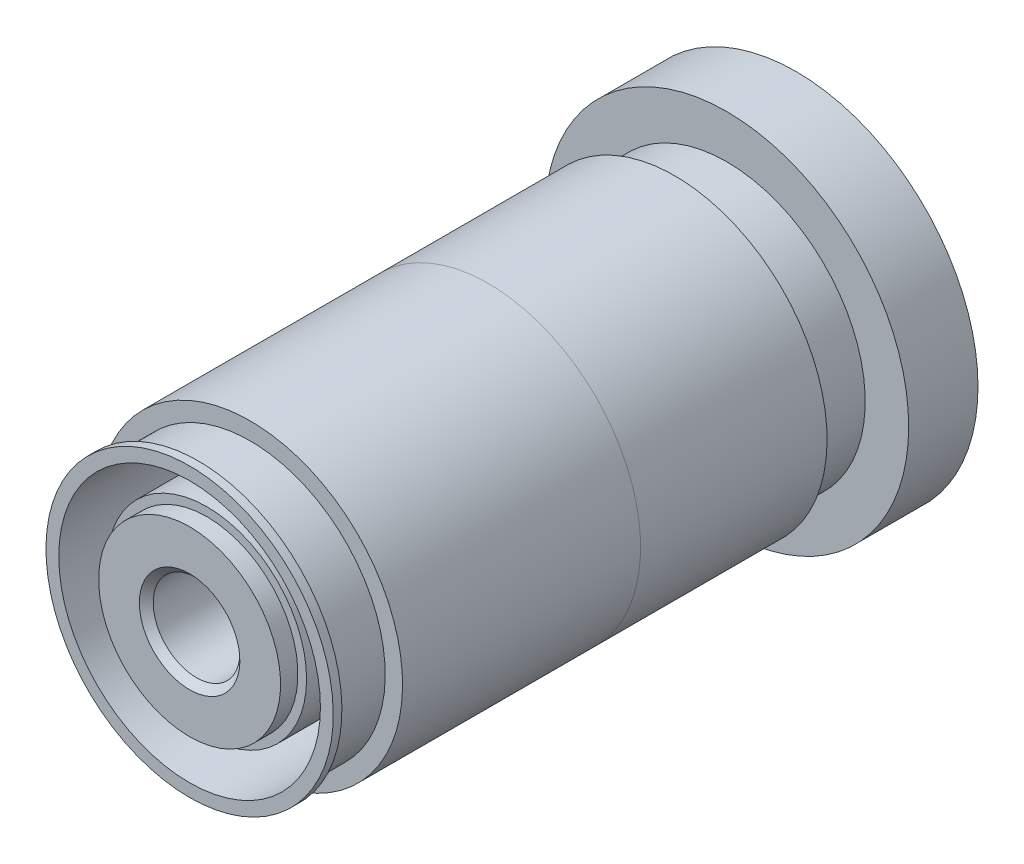
ISO-10303-21;
HEADER;
FILE_DESCRIPTION(('STEP AP214'),'2;1');
FILE_NAME('part.step','',(''),(''),'','','');
FILE_SCHEMA(('AUTOMOTIVE_DESIGN { 1 0 10303 214 1 1 1 1 }'));
ENDSEC;
DATA;
#1=APPLICATION_CONTEXT('core data for automotive mechanical design processes');
#2=APPLICATION_PROTOCOL_DEFINITION('international standard','automotive_design',2000,#1);
#3=PRODUCT_CONTEXT('',#1,'mechanical');
#4=PRODUCT('Part','Part','',(#3));
#5=PRODUCT_RELATED_PRODUCT_CATEGORY('part','',(#4));
#6=PRODUCT_DEFINITION_FORMATION('','',#4);
#7=PRODUCT_DEFINITION_CONTEXT('part definition',#1,'design');
#8=PRODUCT_DEFINITION('design','',#6,#7);
#9=PRODUCT_DEFINITION_SHAPE('','',#8);
#10=(LENGTH_UNIT() NAMED_UNIT(*) SI_UNIT(.MILLI.,.METRE.));
#11=(NAMED_UNIT(*) PLANE_ANGLE_UNIT() SI_UNIT($,.RADIAN.));
#12=(NAMED_UNIT(*) SI_UNIT($,.STERADIAN.) SOLID_ANGLE_UNIT());
#13=UNCERTAINTY_MEASURE_WITH_UNIT(LENGTH_MEASURE(1.E-05),#10,'distance_accuracy_value','');
#14=(GEOMETRIC_REPRESENTATION_CONTEXT(3) GLOBAL_UNCERTAINTY_ASSIGNED_CONTEXT((#13)) GLOBAL_UNIT_ASSIGNED_CONTEXT((#10,
#11,#12)) REPRESENTATION_CONTEXT('',''));
#15=CARTESIAN_POINT('',(0.,0.,0.));
#16=DIRECTION('',(0.,0.,1.));
#17=DIRECTION('',(1.,0.,0.));
#18=AXIS2_PLACEMENT_3D('',#15,#16,#17);
#19=CARTESIAN_POINT('',(0.,0.,160.));
#20=DIRECTION('',(0.,0.,1.));
#21=DIRECTION('',(0.,-1.,0.));
#22=AXIS2_PLACEMENT_3D('',#19,#20,#21);
#23=CYLINDRICAL_SURFACE('',#22,87.9);
#24=CARTESIAN_POINT('',(0.,0.,125.));
#25=DIRECTION('',(0.,0.,1.));
#26=DIRECTION('',(0.,-1.,0.));
#27=AXIS2_PLACEMENT_3D('',#24,#25,#26);
#28=CIRCLE('',#27,87.9);
#29=CARTESIAN_POINT('',(0.,-87.9,125.));
#30=VERTEX_POINT('',#29);
#31=EDGE_CURVE('E88',#30,#30,#28,.T.);
#32=ORIENTED_EDGE('',*,*,#31,.F.);
#33=EDGE_LOOP('',(#32));
#34=FACE_BOUND('',#33,.T.);
#35=CARTESIAN_POINT('',(0.,0.,-12.3890468293461));
#36=DIRECTION('',(0.,0.,-1.));
#37=DIRECTION('',(-1.,0.,0.));
#38=AXIS2_PLACEMENT_3D('',#35,#36,#37);
#39=CIRCLE('',#38,87.9);
#40=CARTESIAN_POINT('',(-87.9,0.,-12.3890468293461));
#41=VERTEX_POINT('',#40);
#42=EDGE_CURVE('E61',#41,#41,#39,.T.);
#43=ORIENTED_EDGE('',*,*,#42,.F.);
#44=EDGE_LOOP('',(#43));
#45=FACE_BOUND('',#44,.T.);
#46=ADVANCED_FACE('F47',(#34,#45),#23,.T.);
#47=CARTESIAN_POINT('',(0.,0.,-190.));
#48=DIRECTION('',(0.,0.,1.));
#49=DIRECTION('',(0.,-1.,0.));
#50=AXIS2_PLACEMENT_3D('',#47,#48,#49);
#51=PLANE('',#50);
#52=CARTESIAN_POINT('',(0.,0.,-190.));
#53=DIRECTION('',(0.,0.,-1.));
#54=DIRECTION('',(0.,1.,0.));
#55=AXIS2_PLACEMENT_3D('',#52,#53,#54);
#56=CIRCLE('',#55,25.);
#57=CARTESIAN_POINT('',(0.,25.,-190.));
#58=VERTEX_POINT('',#57);
#59=EDGE_CURVE('E132',#58,#58,#56,.T.);
#60=ORIENTED_EDGE('',*,*,#59,.F.);
#61=EDGE_LOOP('',(#60));
#62=FACE_BOUND('',#61,.T.);
#63=CARTESIAN_POINT('',(0.,0.,-190.));
#64=DIRECTION('',(0.,0.,1.));
#65=DIRECTION('',(0.,-1.,0.));
#66=AXIS2_PLACEMENT_3D('',#63,#64,#65);
#67=CIRCLE('',#66,105.);
#68=CARTESIAN_POINT('',(0.,-105.,-190.));
#69=VERTEX_POINT('',#68);
#70=EDGE_CURVE('E66',#69,#69,#67,.T.);
#71=ORIENTED_EDGE('',*,*,#70,.F.);
#72=EDGE_LOOP('',(#71));
#73=FACE_BOUND('',#72,.T.);
#74=ADVANCED_FACE('F139',(#62,#73),#51,.F.);
#75=CARTESIAN_POINT('',(0.,0.,160.));
#76=DIRECTION('',(0.,0.,1.));
#77=DIRECTION('',(0.,-1.,0.));
#78=AXIS2_PLACEMENT_3D('',#75,#76,#77);
#79=CYLINDRICAL_SURFACE('',#78,105.);
#80=CARTESIAN_POINT('',(0.,0.,-150.));
#81=DIRECTION('',(0.,0.,1.));
#82=DIRECTION('',(0.,-1.,0.));
#83=AXIS2_PLACEMENT_3D('',#80,#81,#82);
#84=CIRCLE('',#83,105.);
#85=CARTESIAN_POINT('',(0.,-105.,-150.));
#86=VERTEX_POINT('',#85);
#87=EDGE_CURVE('E72',#86,#86,#84,.T.);
#88=ORIENTED_EDGE('',*,*,#87,.F.);
#89=EDGE_LOOP('',(#88));
#90=FACE_BOUND('',#89,.T.);
#91=ORIENTED_EDGE('',*,*,#70,.T.);
#92=EDGE_LOOP('',(#91));
#93=FACE_BOUND('',#92,.T.);
#94=ADVANCED_FACE('F142',(#90,#93),#79,.T.);
#95=CARTESIAN_POINT('',(0.,79.9,-150.));
#96=DIRECTION('',(0.,0.,-1.));
#97=DIRECTION('',(0.,1.,0.));
#98=AXIS2_PLACEMENT_3D('',#95,#96,#97);
#99=PLANE('',#98);
#100=CARTESIAN_POINT('',(0.,0.,-150.));
#101=DIRECTION('',(0.,0.,1.));
#102=DIRECTION('',(0.,-1.,0.));
#103=AXIS2_PLACEMENT_3D('',#100,#101,#102);
#104=CIRCLE('',#103,79.9);
#105=CARTESIAN_POINT('',(0.,-79.9,-150.));
#106=VERTEX_POINT('',#105);
#107=EDGE_CURVE('E76',#106,#106,#104,.T.);
#108=ORIENTED_EDGE('',*,*,#107,.F.);
#109=EDGE_LOOP('',(#108));
#110=FACE_BOUND('',#109,.T.);
#111=ORIENTED_EDGE('',*,*,#87,.T.);
#112=EDGE_LOOP('',(#111));
#113=FACE_BOUND('',#112,.T.);
#114=ADVANCED_FACE('F146',(#110,#113),#99,.F.);
#115=CARTESIAN_POINT('',(0.,0.,160.));
#116=DIRECTION('',(0.,0.,1.));
#117=DIRECTION('',(0.,-1.,0.));
#118=AXIS2_PLACEMENT_3D('',#115,#116,#117);
#119=CYLINDRICAL_SURFACE('',#118,79.9);
#120=CARTESIAN_POINT('',(0.,0.,-120.));
#121=DIRECTION('',(0.,0.,1.));
#122=DIRECTION('',(0.,-1.,0.));
#123=AXIS2_PLACEMENT_3D('',#120,#121,#122);
#124=CIRCLE('',#123,79.9);
#125=CARTESIAN_POINT('',(0.,-79.9,-120.));
#126=VERTEX_POINT('',#125);
#127=EDGE_CURVE('E80',#126,#126,#124,.T.);
#128=ORIENTED_EDGE('',*,*,#127,.F.);
#129=EDGE_LOOP('',(#128));
#130=FACE_BOUND('',#129,.T.);
#131=ORIENTED_EDGE('',*,*,#107,.T.);
#132=EDGE_LOOP('',(#131));
#133=FACE_BOUND('',#132,.T.);
#134=ADVANCED_FACE('F152',(#130,#133),#119,.T.);
#135=CARTESIAN_POINT('',(0.,79.9,-120.));
#136=DIRECTION('',(0.,0.,1.));
#137=DIRECTION('',(0.,-1.,0.));
#138=AXIS2_PLACEMENT_3D('',#135,#136,#137);
#139=PLANE('',#138);
#140=CARTESIAN_POINT('',(0.,0.,-120.));
#141=DIRECTION('',(0.,0.,1.));
#142=DIRECTION('',(0.,-1.,0.));
#143=AXIS2_PLACEMENT_3D('',#140,#141,#142);
#144=CIRCLE('',#143,87.9);
#145=CARTESIAN_POINT('',(0.,-87.9,-120.));
#146=VERTEX_POINT('',#145);
#147=EDGE_CURVE('E84',#146,#146,#144,.T.);
#148=ORIENTED_EDGE('',*,*,#147,.F.);
#149=EDGE_LOOP('',(#148));
#150=FACE_BOUND('',#149,.T.);
#151=ORIENTED_EDGE('',*,*,#127,.T.);
#152=EDGE_LOOP('',(#151));
#153=FACE_BOUND('',#152,.T.);
#154=ADVANCED_FACE('F168',(#150,#153),#139,.F.);
#155=ORIENTED_EDGE('',*,*,#42,.T.);
#156=EDGE_LOOP('',(#155));
#157=FACE_BOUND('',#156,.T.);
#158=ORIENTED_EDGE('',*,*,#147,.T.);
#159=EDGE_LOOP('',(#158));
#160=FACE_BOUND('',#159,.T.);
#161=ADVANCED_FACE('F159',(#157,#160),#23,.T.);
#162=CARTESIAN_POINT('',(0.,87.9,125.));
#163=DIRECTION('',(0.,0.,-1.));
#164=DIRECTION('',(0.,1.,0.));
#165=AXIS2_PLACEMENT_3D('',#162,#163,#164);
#166=PLANE('',#165);
#167=CARTESIAN_POINT('',(0.,0.,125.));
#168=DIRECTION('',(0.,0.,1.));
#169=DIRECTION('',(0.,-1.,0.));
#170=AXIS2_PLACEMENT_3D('',#167,#168,#169);
#171=CIRCLE('',#170,77.9);
#172=CARTESIAN_POINT('',(0.,-77.9,125.));
#173=VERTEX_POINT('',#172);
#174=EDGE_CURVE('E92',#173,#173,#171,.T.);
#175=ORIENTED_EDGE('',*,*,#174,.F.);
#176=EDGE_LOOP('',(#175));
#177=FACE_BOUND('',#176,.T.);
#178=ORIENTED_EDGE('',*,*,#31,.T.);
#179=EDGE_LOOP('',(#178));
#180=FACE_BOUND('',#179,.T.);
#181=ADVANCED_FACE('F167',(#177,#180),#166,.F.);
#182=CARTESIAN_POINT('',(0.,0.,160.));
#183=DIRECTION('',(0.,0.,1.));
#184=DIRECTION('',(0.,-1.,0.));
#185=AXIS2_PLACEMENT_3D('',#182,#183,#184);
#186=CYLINDRICAL_SURFACE('',#185,77.9);
#187=CARTESIAN_POINT('',(0.,0.,155.));
#188=DIRECTION('',(0.,0.,1.));
#189=DIRECTION('',(0.,-1.,0.));
#190=AXIS2_PLACEMENT_3D('',#187,#188,#189);
#191=CIRCLE('',#190,77.9);
#192=CARTESIAN_POINT('',(0.,-77.9,155.));
#193=VERTEX_POINT('',#192);
#194=EDGE_CURVE('E96',#193,#193,#191,.T.);
#195=ORIENTED_EDGE('',*,*,#194,.F.);
#196=EDGE_LOOP('',(#195));
#197=FACE_BOUND('',#196,.T.);
#198=ORIENTED_EDGE('',*,*,#174,.T.);
#199=EDGE_LOOP('',(#198));
#200=FACE_BOUND('',#199,.T.);
#201=ADVANCED_FACE('F174',(#197,#200),#186,.T.);
#202=CARTESIAN_POINT('',(0.,77.9,155.));
#203=DIRECTION('',(0.,0.,1.));
#204=DIRECTION('',(0.,-1.,0.));
#205=AXIS2_PLACEMENT_3D('',#202,#203,#204);
#206=PLANE('',#205);
#207=CARTESIAN_POINT('',(0.,0.,155.));
#208=DIRECTION('',(0.,0.,1.));
#209=DIRECTION('',(0.,-1.,0.));
#210=AXIS2_PLACEMENT_3D('',#207,#208,#209);
#211=CIRCLE('',#210,82.9);
#212=CARTESIAN_POINT('',(0.,-82.9,155.));
#213=VERTEX_POINT('',#212);
#214=EDGE_CURVE('E100',#213,#213,#211,.T.);
#215=ORIENTED_EDGE('',*,*,#214,.F.);
#216=EDGE_LOOP('',(#215));
#217=FACE_BOUND('',#216,.T.);
#218=ORIENTED_EDGE('',*,*,#194,.T.);
#219=EDGE_LOOP('',(#218));
#220=FACE_BOUND('',#219,.T.);
#221=ADVANCED_FACE('F344',(#217,#220),#206,.F.);
#222=CARTESIAN_POINT('',(0.,0.,160.));
#223=DIRECTION('',(0.,0.,1.));
#224=DIRECTION('',(0.,-1.,0.));
#225=AXIS2_PLACEMENT_3D('',#222,#223,#224);
#226=CYLINDRICAL_SURFACE('',#225,82.9);
#227=CARTESIAN_POINT('',(0.,0.,160.));
#228=DIRECTION('',(0.,0.,1.));
#229=DIRECTION('',(0.,-1.,0.));
#230=AXIS2_PLACEMENT_3D('',#227,#228,#229);
#231=CIRCLE('',#230,82.9);
#232=CARTESIAN_POINT('',(0.,-82.9,160.));
#233=VERTEX_POINT('',#232);
#234=EDGE_CURVE('E104',#233,#233,#231,.T.);
#235=ORIENTED_EDGE('',*,*,#234,.F.);
#236=EDGE_LOOP('',(#235));
#237=FACE_BOUND('',#236,.T.);
#238=ORIENTED_EDGE('',*,*,#214,.T.);
#239=EDGE_LOOP('',(#238));
#240=FACE_BOUND('',#239,.T.);
#241=ADVANCED_FACE('F332',(#237,#240),#226,.T.);
#242=CARTESIAN_POINT('',(0.,82.9,160.));
#243=DIRECTION('',(0.,0.,-1.));
#244=DIRECTION('',(0.,1.,0.));
#245=AXIS2_PLACEMENT_3D('',#242,#243,#244);
#246=PLANE('',#245);
#247=CARTESIAN_POINT('',(0.,0.,160.));
#248=DIRECTION('',(0.,0.,1.));
#249=DIRECTION('',(0.,-1.,0.));
#250=AXIS2_PLACEMENT_3D('',#247,#248,#249);
#251=CIRCLE('',#250,75.5);
#252=CARTESIAN_POINT('',(0.,-75.5,160.));
#253=VERTEX_POINT('',#252);
#254=EDGE_CURVE('E108',#253,#253,#251,.T.);
#255=ORIENTED_EDGE('',*,*,#254,.F.);
#256=EDGE_LOOP('',(#255));
#257=FACE_BOUND('',#256,.T.);
#258=ORIENTED_EDGE('',*,*,#234,.T.);
#259=EDGE_LOOP('',(#258));
#260=FACE_BOUND('',#259,.T.);
#261=ADVANCED_FACE('F320',(#257,#260),#246,.F.);
#262=CARTESIAN_POINT('',(0.,0.,160.));
#263=DIRECTION('',(0.,0.,1.));
#264=DIRECTION('',(0.,-1.,0.));
#265=AXIS2_PLACEMENT_3D('',#262,#263,#264);
#266=CYLINDRICAL_SURFACE('',#265,75.5);
#267=CARTESIAN_POINT('',(0.,0.,-150.));
#268=DIRECTION('',(0.,0.,1.));
#269=DIRECTION('',(0.,-1.,0.));
#270=AXIS2_PLACEMENT_3D('',#267,#268,#269);
#271=CIRCLE('',#270,75.5);
#272=CARTESIAN_POINT('',(0.,-75.5,-150.));
#273=VERTEX_POINT('',#272);
#274=EDGE_CURVE('E112',#273,#273,#271,.T.);
#275=ORIENTED_EDGE('',*,*,#274,.F.);
#276=EDGE_LOOP('',(#275));
#277=FACE_BOUND('',#276,.T.);
#278=ORIENTED_EDGE('',*,*,#254,.T.);
#279=EDGE_LOOP('',(#278));
#280=FACE_BOUND('',#279,.T.);
#281=ADVANCED_FACE('F308',(#277,#280),#266,.F.);
#282=CARTESIAN_POINT('',(0.,75.5,-150.));
#283=DIRECTION('',(0.,0.,-1.));
#284=DIRECTION('',(0.,1.,0.));
#285=AXIS2_PLACEMENT_3D('',#282,#283,#284);
#286=PLANE('',#285);
#287=CARTESIAN_POINT('',(0.,0.,-150.));
#288=DIRECTION('',(0.,0.,1.));
#289=DIRECTION('',(0.,-1.,0.));
#290=AXIS2_PLACEMENT_3D('',#287,#288,#289);
#291=CIRCLE('',#290,57.5);
#292=CARTESIAN_POINT('',(0.,-57.5,-150.));
#293=VERTEX_POINT('',#292);
#294=EDGE_CURVE('E116',#293,#293,#291,.T.);
#295=ORIENTED_EDGE('',*,*,#294,.F.);
#296=EDGE_LOOP('',(#295));
#297=FACE_BOUND('',#296,.T.);
#298=ORIENTED_EDGE('',*,*,#274,.T.);
#299=EDGE_LOOP('',(#298));
#300=FACE_BOUND('',#299,.T.);
#301=ADVANCED_FACE('F296',(#297,#300),#286,.F.);
#302=CARTESIAN_POINT('',(0.,0.,160.));
#303=DIRECTION('',(0.,0.,1.));
#304=DIRECTION('',(0.,-1.,0.));
#305=AXIS2_PLACEMENT_3D('',#302,#303,#304);
#306=CYLINDRICAL_SURFACE('',#305,57.5);
#307=CARTESIAN_POINT('',(0.,0.,150.));
#308=DIRECTION('',(0.,0.,1.));
#309=DIRECTION('',(0.,-1.,0.));
#310=AXIS2_PLACEMENT_3D('',#307,#308,#309);
#311=CIRCLE('',#310,57.5);
#312=CARTESIAN_POINT('',(0.,-57.5,150.));
#313=VERTEX_POINT('',#312);
#314=EDGE_CURVE('E120',#313,#313,#311,.T.);
#315=ORIENTED_EDGE('',*,*,#314,.F.);
#316=EDGE_LOOP('',(#315));
#317=FACE_BOUND('',#316,.T.);
#318=ORIENTED_EDGE('',*,*,#294,.T.);
#319=EDGE_LOOP('',(#318));
#320=FACE_BOUND('',#319,.T.);
#321=ADVANCED_FACE('F284',(#317,#320),#306,.T.);
#322=CARTESIAN_POINT('',(0.,57.5,150.));
#323=DIRECTION('',(0.,0.,-1.));
#324=DIRECTION('',(0.,1.,0.));
#325=AXIS2_PLACEMENT_3D('',#322,#323,#324);
#326=PLANE('',#325);
#327=CARTESIAN_POINT('',(0.,0.,150.));
#328=DIRECTION('',(0.,0.,1.));
#329=DIRECTION('',(0.,-1.,0.));
#330=AXIS2_PLACEMENT_3D('',#327,#328,#329);
#331=CIRCLE('',#330,52.5);
#332=CARTESIAN_POINT('',(0.,-52.5,150.));
#333=VERTEX_POINT('',#332);
#334=EDGE_CURVE('E124',#333,#333,#331,.T.);
#335=ORIENTED_EDGE('',*,*,#334,.F.);
#336=EDGE_LOOP('',(#335));
#337=FACE_BOUND('',#336,.T.);
#338=ORIENTED_EDGE('',*,*,#314,.T.);
#339=EDGE_LOOP('',(#338));
#340=FACE_BOUND('',#339,.T.);
#341=ADVANCED_FACE('F274',(#337,#340),#326,.F.);
#342=CARTESIAN_POINT('',(0.,0.,160.));
#343=DIRECTION('',(0.,0.,1.));
#344=DIRECTION('',(0.,-1.,0.));
#345=AXIS2_PLACEMENT_3D('',#342,#343,#344);
#346=CYLINDRICAL_SURFACE('',#345,52.5);
#347=CARTESIAN_POINT('',(0.,0.,160.));
#348=DIRECTION('',(0.,0.,1.));
#349=DIRECTION('',(0.,-1.,0.));
#350=AXIS2_PLACEMENT_3D('',#347,#348,#349);
#351=CIRCLE('',#350,52.5);
#352=CARTESIAN_POINT('',(0.,-52.5,160.));
#353=VERTEX_POINT('',#352);
#354=EDGE_CURVE('E128',#353,#353,#351,.T.);
#355=ORIENTED_EDGE('',*,*,#354,.F.);
#356=EDGE_LOOP('',(#355));
#357=FACE_BOUND('',#356,.T.);
#358=ORIENTED_EDGE('',*,*,#334,.T.);
#359=EDGE_LOOP('',(#358));
#360=FACE_BOUND('',#359,.T.);
#361=ADVANCED_FACE('F220',(#357,#360),#346,.T.);
#362=CARTESIAN_POINT('',(0.,52.5,160.));
#363=DIRECTION('',(0.,0.,-1.));
#364=DIRECTION('',(0.,1.,0.));
#365=AXIS2_PLACEMENT_3D('',#362,#363,#364);
#366=PLANE('',#365);
#367=CARTESIAN_POINT('',(0.,0.,160.));
#368=DIRECTION('',(0.,0.,-1.));
#369=DIRECTION('',(0.,1.,0.));
#370=AXIS2_PLACEMENT_3D('',#367,#368,#369);
#371=CIRCLE('',#370,29.);
#372=CARTESIAN_POINT('',(0.,29.,160.));
#373=VERTEX_POINT('',#372);
#374=EDGE_CURVE('E10',#373,#373,#371,.T.);
#375=ORIENTED_EDGE('',*,*,#374,.T.);
#376=EDGE_LOOP('',(#375));
#377=FACE_BOUND('',#376,.T.);
#378=ORIENTED_EDGE('',*,*,#354,.T.);
#379=EDGE_LOOP('',(#378));
#380=FACE_BOUND('',#379,.T.);
#381=ADVANCED_FACE('F216',(#377,#380),#366,.F.);
#382=CARTESIAN_POINT('',(0.,0.,230.710678118655));
#383=DIRECTION('',(0.,0.,-1.));
#384=DIRECTION('',(0.,1.,0.));
#385=AXIS2_PLACEMENT_3D('',#382,#383,#384);
#386=CYLINDRICAL_SURFACE('',#385,25.);
#387=CARTESIAN_POINT('',(0.,0.,156.));
#388=DIRECTION('',(0.,0.,-1.));
#389=DIRECTION('',(0.,1.,0.));
#390=AXIS2_PLACEMENT_3D('',#387,#388,#389);
#391=CIRCLE('',#390,25.);
#392=CARTESIAN_POINT('',(0.,25.,156.));
#393=VERTEX_POINT('',#392);
#394=EDGE_CURVE('E56',#393,#393,#391,.F.);
#395=ORIENTED_EDGE('',*,*,#394,.T.);
#396=EDGE_LOOP('',(#395));
#397=FACE_BOUND('',#396,.T.);
#398=ORIENTED_EDGE('',*,*,#59,.T.);
#399=EDGE_LOOP('',(#398));
#400=FACE_BOUND('',#399,.T.);
#401=ADVANCED_FACE('F137',(#397,#400),#386,.F.);
#402=CARTESIAN_POINT('',(0.,0.,156.));
#403=DIRECTION('',(0.,0.,1.));
#404=DIRECTION('',(0.,-1.,0.));
#405=AXIS2_PLACEMENT_3D('',#402,#403,#404);
#406=CONICAL_SURFACE('',#405,25.,0.78539816339745);
#407=ORIENTED_EDGE('',*,*,#374,.F.);
#408=EDGE_LOOP('',(#407));
#409=FACE_BOUND('',#408,.T.);
#410=ORIENTED_EDGE('',*,*,#394,.F.);
#411=EDGE_LOOP('',(#410));
#412=FACE_BOUND('',#411,.T.);
#413=ADVANCED_FACE('F50',(#409,#412),#406,.F.);
#414=CLOSED_SHELL('',(#46,#74,#94,#114,#134,#154,#161,#181,#201,#221,#241,#261,#281,#301,#321,
#341,#361,#381,#401,#413));
#415=MANIFOLD_SOLID_BREP('B2',#414);
#416=ADVANCED_BREP_SHAPE_REPRESENTATION('',(#18,#415),#14);
#417=SHAPE_DEFINITION_REPRESENTATION(#9,#416);
ENDSEC;
END-ISO-10303-21;
